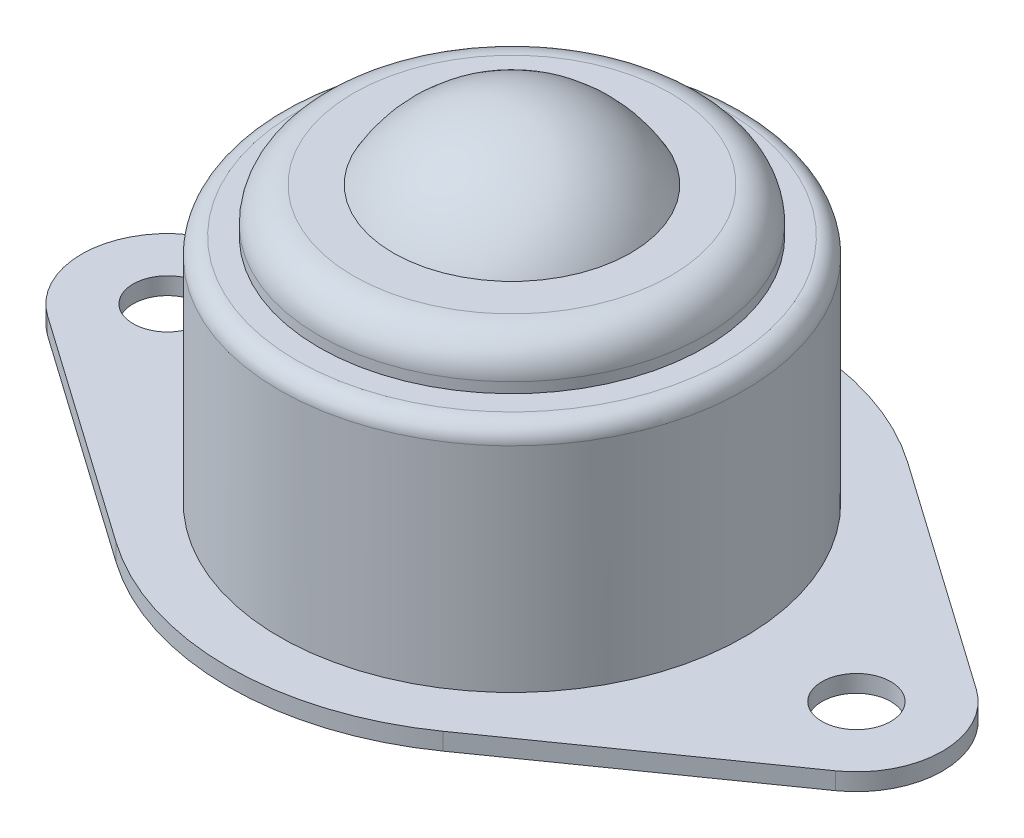
ISO-10303-21;
HEADER;
FILE_DESCRIPTION(('STEP AP214'),'2;1');
FILE_NAME('part.step','',(''),(''),'','','');
FILE_SCHEMA(('AUTOMOTIVE_DESIGN { 1 0 10303 214 1 1 1 1 }'));
ENDSEC;
DATA;
#1=APPLICATION_CONTEXT('core data for automotive mechanical design processes');
#2=APPLICATION_PROTOCOL_DEFINITION('international standard','automotive_design',2000,#1);
#3=PRODUCT_CONTEXT('',#1,'mechanical');
#4=PRODUCT('Part','Part','',(#3));
#5=PRODUCT_RELATED_PRODUCT_CATEGORY('part','',(#4));
#6=PRODUCT_DEFINITION_FORMATION('','',#4);
#7=PRODUCT_DEFINITION_CONTEXT('part definition',#1,'design');
#8=PRODUCT_DEFINITION('design','',#6,#7);
#9=PRODUCT_DEFINITION_SHAPE('','',#8);
#10=(LENGTH_UNIT() NAMED_UNIT(*) SI_UNIT(.MILLI.,.METRE.));
#11=(NAMED_UNIT(*) PLANE_ANGLE_UNIT() SI_UNIT($,.RADIAN.));
#12=(NAMED_UNIT(*) SI_UNIT($,.STERADIAN.) SOLID_ANGLE_UNIT());
#13=UNCERTAINTY_MEASURE_WITH_UNIT(LENGTH_MEASURE(1.E-05),#10,'distance_accuracy_value','');
#14=(GEOMETRIC_REPRESENTATION_CONTEXT(3) GLOBAL_UNCERTAINTY_ASSIGNED_CONTEXT((#13)) GLOBAL_UNIT_ASSIGNED_CONTEXT((#10,
#11,#12)) REPRESENTATION_CONTEXT('',''));
#15=CARTESIAN_POINT('',(0.,0.,0.));
#16=DIRECTION('',(0.,0.,1.));
#17=DIRECTION('',(1.,0.,0.));
#18=AXIS2_PLACEMENT_3D('',#15,#16,#17);
#19=CARTESIAN_POINT('',(0.,12.0625,0.));
#20=DIRECTION('',(0.,-1.,0.));
#21=DIRECTION('',(-1.,0.,0.));
#22=AXIS2_PLACEMENT_3D('',#19,#20,#21);
#23=SPHERICAL_SURFACE('',#22,7.9375);
#24=CARTESIAN_POINT('',(0.,4.125,0.));
#25=VERTEX_POINT('',#24);
#26=VERTEX_LOOP('',#25);
#27=FACE_BOUND('',#26,.T.);
#28=ADVANCED_FACE('F53',(#27),#23,.T.);
#29=CLOSED_SHELL('',(#28));
#30=MANIFOLD_SOLID_BREP('B2',#29);
#31=CARTESIAN_POINT('',(0.,12.0625,0.));
#32=DIRECTION('',(0.,-1.,0.));
#33=DIRECTION('',(-1.,0.,0.));
#34=AXIS2_PLACEMENT_3D('',#31,#32,#33);
#35=SPHERICAL_SURFACE('',#34,7.9375);
#36=CARTESIAN_POINT('',(0.,16.,0.));
#37=DIRECTION('',(0.,-1.,0.));
#38=DIRECTION('',(0.,0.,-1.));
#39=AXIS2_PLACEMENT_3D('',#36,#37,#38);
#40=CIRCLE('',#39,6.89202437604511);
#41=CARTESIAN_POINT('',(0.,16.,-6.89202437604511));
#42=VERTEX_POINT('',#41);
#43=EDGE_CURVE('E224',#42,#42,#40,.T.);
#44=ORIENTED_EDGE('',*,*,#43,.F.);
#45=EDGE_LOOP('',(#44));
#46=FACE_BOUND('',#45,.T.);
#47=ADVANCED_FACE('F67',(#46),#35,.F.);
#48=CARTESIAN_POINT('',(0.,16.,0.));
#49=DIRECTION('',(0.,1.,0.));
#50=DIRECTION('',(0.,0.,1.));
#51=AXIS2_PLACEMENT_3D('',#48,#49,#50);
#52=PLANE('',#51);
#53=CARTESIAN_POINT('',(0.,16.,0.));
#54=DIRECTION('',(0.,1.,0.));
#55=DIRECTION('',(0.,0.,1.));
#56=AXIS2_PLACEMENT_3D('',#53,#54,#55);
#57=CIRCLE('',#56,9.2);
#58=CARTESIAN_POINT('',(0.,16.,9.2));
#59=VERTEX_POINT('',#58);
#60=EDGE_CURVE('E51',#59,#59,#57,.T.);
#61=ORIENTED_EDGE('',*,*,#60,.T.);
#62=EDGE_LOOP('',(#61));
#63=FACE_BOUND('',#62,.T.);
#64=ORIENTED_EDGE('',*,*,#43,.T.);
#65=EDGE_LOOP('',(#64));
#66=FACE_BOUND('',#65,.T.);
#67=ADVANCED_FACE('F251',(#63,#66),#52,.T.);
#68=CARTESIAN_POINT('',(0.,0.,0.));
#69=DIRECTION('',(0.,-1.,0.));
#70=DIRECTION('',(0.,0.,-1.));
#71=AXIS2_PLACEMENT_3D('',#68,#69,#70);
#72=CYLINDRICAL_SURFACE('',#71,11.2);
#73=CARTESIAN_POINT('',(0.,14.,0.));
#74=DIRECTION('',(0.,1.,0.));
#75=DIRECTION('',(0.,0.,1.));
#76=AXIS2_PLACEMENT_3D('',#73,#74,#75);
#77=CIRCLE('',#76,11.2);
#78=CARTESIAN_POINT('',(0.,14.,11.2));
#79=VERTEX_POINT('',#78);
#80=EDGE_CURVE('E77',#79,#79,#77,.F.);
#81=ORIENTED_EDGE('',*,*,#80,.T.);
#82=EDGE_LOOP('',(#81));
#83=FACE_BOUND('',#82,.T.);
#84=CARTESIAN_POINT('',(0.,13.4,0.));
#85=DIRECTION('',(0.,-1.,0.));
#86=DIRECTION('',(0.,0.,-1.));
#87=AXIS2_PLACEMENT_3D('',#84,#85,#86);
#88=CIRCLE('',#87,11.2);
#89=CARTESIAN_POINT('',(0.,13.4,-11.2));
#90=VERTEX_POINT('',#89);
#91=EDGE_CURVE('E220',#90,#90,#88,.T.);
#92=ORIENTED_EDGE('',*,*,#91,.F.);
#93=EDGE_LOOP('',(#92));
#94=FACE_BOUND('',#93,.T.);
#95=ADVANCED_FACE('F239',(#83,#94),#72,.T.);
#96=CARTESIAN_POINT('',(0.,13.4,0.));
#97=DIRECTION('',(0.,1.,0.));
#98=DIRECTION('',(0.,0.,1.));
#99=AXIS2_PLACEMENT_3D('',#96,#97,#98);
#100=PLANE('',#99);
#101=CARTESIAN_POINT('',(0.,13.4,0.));
#102=DIRECTION('',(0.,1.,0.));
#103=DIRECTION('',(0.,0.,1.));
#104=AXIS2_PLACEMENT_3D('',#101,#102,#103);
#105=CIRCLE('',#104,12.5);
#106=CARTESIAN_POINT('',(0.,13.4,12.5));
#107=VERTEX_POINT('',#106);
#108=EDGE_CURVE('E232',#107,#107,#105,.T.);
#109=ORIENTED_EDGE('',*,*,#108,.T.);
#110=EDGE_LOOP('',(#109));
#111=FACE_BOUND('',#110,.T.);
#112=ORIENTED_EDGE('',*,*,#91,.T.);
#113=EDGE_LOOP('',(#112));
#114=FACE_BOUND('',#113,.T.);
#115=ADVANCED_FACE('F262',(#111,#114),#100,.T.);
#116=CARTESIAN_POINT('',(0.,0.,0.));
#117=DIRECTION('',(0.,-1.,0.));
#118=DIRECTION('',(0.,0.,-1.));
#119=AXIS2_PLACEMENT_3D('',#116,#117,#118);
#120=CYLINDRICAL_SURFACE('',#119,13.5);
#121=CARTESIAN_POINT('',(0.,12.4,0.));
#122=DIRECTION('',(0.,1.,0.));
#123=DIRECTION('',(0.,0.,1.));
#124=AXIS2_PLACEMENT_3D('',#121,#122,#123);
#125=CIRCLE('',#124,13.5);
#126=CARTESIAN_POINT('',(0.,12.4,13.5));
#127=VERTEX_POINT('',#126);
#128=EDGE_CURVE('E228',#127,#127,#125,.F.);
#129=ORIENTED_EDGE('',*,*,#128,.T.);
#130=EDGE_LOOP('',(#129));
#131=FACE_BOUND('',#130,.T.);
#132=CARTESIAN_POINT('',(0.,0.,0.));
#133=DIRECTION('',(0.,-1.,0.));
#134=DIRECTION('',(0.,0.,-1.));
#135=AXIS2_PLACEMENT_3D('',#132,#133,#134);
#136=CIRCLE('',#135,13.5);
#137=CARTESIAN_POINT('',(0.,0.,-13.5));
#138=VERTEX_POINT('',#137);
#139=EDGE_CURVE('E216',#138,#138,#136,.T.);
#140=ORIENTED_EDGE('',*,*,#139,.F.);
#141=EDGE_LOOP('',(#140));
#142=FACE_BOUND('',#141,.T.);
#143=ADVANCED_FACE('F265',(#131,#142),#120,.T.);
#144=CARTESIAN_POINT('',(-20.,-1.,0.));
#145=DIRECTION('',(0.,-1.,0.));
#146=DIRECTION('',(0.,0.,-1.));
#147=AXIS2_PLACEMENT_3D('',#144,#145,#146);
#148=PLANE('',#147);
#149=CARTESIAN_POINT('',(-20.,-1.,0.));
#150=DIRECTION('',(0.,-1.,0.));
#151=DIRECTION('',(0.,0.,-1.));
#152=AXIS2_PLACEMENT_3D('',#149,#150,#151);
#153=CIRCLE('',#152,2.);
#154=CARTESIAN_POINT('',(-20.,-1.,-2.));
#155=VERTEX_POINT('',#154);
#156=EDGE_CURVE('E177',#155,#155,#153,.T.);
#157=ORIENTED_EDGE('',*,*,#156,.F.);
#158=EDGE_LOOP('',(#157));
#159=FACE_BOUND('',#158,.T.);
#160=CARTESIAN_POINT('',(-20.,-1.,0.));
#161=DIRECTION('',(0.,-1.,0.));
#162=DIRECTION('',(0.,0.,-1.));
#163=AXIS2_PLACEMENT_3D('',#160,#161,#162);
#164=CIRCLE('',#163,5.);
#165=CARTESIAN_POINT('',(-22.875,-1.,4.0907670429884));
#166=VERTEX_POINT('',#165);
#167=CARTESIAN_POINT('',(-22.875,-1.,-4.09076704298839));
#168=VERTEX_POINT('',#167);
#169=EDGE_CURVE('E194',#166,#168,#164,.T.);
#170=ORIENTED_EDGE('',*,*,#169,.T.);
#171=DIRECTION('',(0.818153408597678,0.,-0.575));
#172=VECTOR('',#171,1.);
#173=CARTESIAN_POINT('',(-9.4875,-1.,-13.4995312418617));
#174=LINE('',#173,#172);
#175=CARTESIAN_POINT('',(-9.4875,-1.,-13.4995312418617));
#176=VERTEX_POINT('',#175);
#177=EDGE_CURVE('E129',#168,#176,#174,.T.);
#178=ORIENTED_EDGE('',*,*,#177,.T.);
#179=CARTESIAN_POINT('',(0.,-1.,0.));
#180=DIRECTION('',(0.,-1.,0.));
#181=DIRECTION('',(0.,0.,-1.));
#182=AXIS2_PLACEMENT_3D('',#179,#180,#181);
#183=CIRCLE('',#182,16.5);
#184=CARTESIAN_POINT('',(9.4875,-1.,-13.4995312418617));
#185=VERTEX_POINT('',#184);
#186=EDGE_CURVE('E334',#176,#185,#183,.T.);
#187=ORIENTED_EDGE('',*,*,#186,.T.);
#188=DIRECTION('',(0.818153408597678,0.,0.575));
#189=VECTOR('',#188,1.);
#190=CARTESIAN_POINT('',(22.875,-1.,-4.0907670429884));
#191=LINE('',#190,#189);
#192=CARTESIAN_POINT('',(22.875,-1.,-4.0907670429884));
#193=VERTEX_POINT('',#192);
#194=EDGE_CURVE('E337',#185,#193,#191,.T.);
#195=ORIENTED_EDGE('',*,*,#194,.T.);
#196=CARTESIAN_POINT('',(20.,-1.,0.));
#197=DIRECTION('',(0.,-1.,0.));
#198=DIRECTION('',(0.,0.,-1.));
#199=AXIS2_PLACEMENT_3D('',#196,#197,#198);
#200=CIRCLE('',#199,5.);
#201=CARTESIAN_POINT('',(22.875,-1.,4.09076704298839));
#202=VERTEX_POINT('',#201);
#203=EDGE_CURVE('E149',#193,#202,#200,.T.);
#204=ORIENTED_EDGE('',*,*,#203,.T.);
#205=DIRECTION('',(-0.818153408597679,0.,0.575));
#206=VECTOR('',#205,1.);
#207=CARTESIAN_POINT('',(9.4875,-1.,13.4995312418617));
#208=LINE('',#207,#206);
#209=CARTESIAN_POINT('',(9.4875,-1.,13.4995312418617));
#210=VERTEX_POINT('',#209);
#211=EDGE_CURVE('E142',#202,#210,#208,.T.);
#212=ORIENTED_EDGE('',*,*,#211,.T.);
#213=CARTESIAN_POINT('',(0.,-1.,0.));
#214=DIRECTION('',(0.,-1.,0.));
#215=DIRECTION('',(0.,0.,-1.));
#216=AXIS2_PLACEMENT_3D('',#213,#214,#215);
#217=CIRCLE('',#216,16.5);
#218=CARTESIAN_POINT('',(-9.4875,-1.,13.4995312418617));
#219=VERTEX_POINT('',#218);
#220=EDGE_CURVE('E147',#210,#219,#217,.T.);
#221=ORIENTED_EDGE('',*,*,#220,.T.);
#222=DIRECTION('',(-0.818153408597678,0.,-0.575));
#223=VECTOR('',#222,1.);
#224=CARTESIAN_POINT('',(-22.875,-1.,4.0907670429884));
#225=LINE('',#224,#223);
#226=EDGE_CURVE('E85',#219,#166,#225,.T.);
#227=ORIENTED_EDGE('',*,*,#226,.T.);
#228=EDGE_LOOP('',(#170,#178,#187,#195,#204,#212,#221,#227));
#229=FACE_BOUND('',#228,.T.);
#230=CARTESIAN_POINT('',(20.,-1.,0.));
#231=DIRECTION('',(0.,-1.,0.));
#232=DIRECTION('',(0.,0.,-1.));
#233=AXIS2_PLACEMENT_3D('',#230,#231,#232);
#234=CIRCLE('',#233,2.);
#235=CARTESIAN_POINT('',(20.,-1.,-2.));
#236=VERTEX_POINT('',#235);
#237=EDGE_CURVE('E313',#236,#236,#234,.T.);
#238=ORIENTED_EDGE('',*,*,#237,.F.);
#239=EDGE_LOOP('',(#238));
#240=FACE_BOUND('',#239,.T.);
#241=ADVANCED_FACE('F144',(#159,#229,#240),#148,.T.);
#242=CARTESIAN_POINT('',(-20.,0.,0.));
#243=DIRECTION('',(0.,-1.,0.));
#244=DIRECTION('',(0.,0.,-1.));
#245=AXIS2_PLACEMENT_3D('',#242,#243,#244);
#246=PLANE('',#245);
#247=ORIENTED_EDGE('',*,*,#139,.T.);
#248=EDGE_LOOP('',(#247));
#249=FACE_BOUND('',#248,.T.);
#250=CARTESIAN_POINT('',(-20.,0.,0.));
#251=DIRECTION('',(0.,-1.,0.));
#252=DIRECTION('',(0.,0.,-1.));
#253=AXIS2_PLACEMENT_3D('',#250,#251,#252);
#254=CIRCLE('',#253,5.);
#255=CARTESIAN_POINT('',(-22.875,0.,4.0907670429884));
#256=VERTEX_POINT('',#255);
#257=CARTESIAN_POINT('',(-22.875,0.,-4.09076704298839));
#258=VERTEX_POINT('',#257);
#259=EDGE_CURVE('E172',#256,#258,#254,.T.);
#260=ORIENTED_EDGE('',*,*,#259,.F.);
#261=DIRECTION('',(-0.818153408597678,0.,-0.575));
#262=VECTOR('',#261,1.);
#263=CARTESIAN_POINT('',(-22.875,0.,4.0907670429884));
#264=LINE('',#263,#262);
#265=CARTESIAN_POINT('',(-9.4875,0.,13.4995312418617));
#266=VERTEX_POINT('',#265);
#267=EDGE_CURVE('E120',#266,#256,#264,.T.);
#268=ORIENTED_EDGE('',*,*,#267,.F.);
#269=CARTESIAN_POINT('',(0.,0.,0.));
#270=DIRECTION('',(0.,-1.,0.));
#271=DIRECTION('',(0.,0.,-1.));
#272=AXIS2_PLACEMENT_3D('',#269,#270,#271);
#273=CIRCLE('',#272,16.5);
#274=CARTESIAN_POINT('',(9.4875,0.,13.4995312418617));
#275=VERTEX_POINT('',#274);
#276=EDGE_CURVE('E114',#275,#266,#273,.T.);
#277=ORIENTED_EDGE('',*,*,#276,.F.);
#278=DIRECTION('',(-0.818153408597679,0.,0.575));
#279=VECTOR('',#278,1.);
#280=CARTESIAN_POINT('',(9.4875,0.,13.4995312418617));
#281=LINE('',#280,#279);
#282=CARTESIAN_POINT('',(22.875,0.,4.09076704298839));
#283=VERTEX_POINT('',#282);
#284=EDGE_CURVE('E158',#283,#275,#281,.T.);
#285=ORIENTED_EDGE('',*,*,#284,.F.);
#286=CARTESIAN_POINT('',(20.,0.,0.));
#287=DIRECTION('',(0.,-1.,0.));
#288=DIRECTION('',(0.,0.,-1.));
#289=AXIS2_PLACEMENT_3D('',#286,#287,#288);
#290=CIRCLE('',#289,5.);
#291=CARTESIAN_POINT('',(22.875,0.,-4.0907670429884));
#292=VERTEX_POINT('',#291);
#293=EDGE_CURVE('E186',#292,#283,#290,.T.);
#294=ORIENTED_EDGE('',*,*,#293,.F.);
#295=DIRECTION('',(0.818153408597678,0.,0.575));
#296=VECTOR('',#295,1.);
#297=CARTESIAN_POINT('',(22.875,0.,-4.0907670429884));
#298=LINE('',#297,#296);
#299=CARTESIAN_POINT('',(9.4875,0.,-13.4995312418617));
#300=VERTEX_POINT('',#299);
#301=EDGE_CURVE('E183',#300,#292,#298,.T.);
#302=ORIENTED_EDGE('',*,*,#301,.F.);
#303=CARTESIAN_POINT('',(0.,0.,0.));
#304=DIRECTION('',(0.,-1.,0.));
#305=DIRECTION('',(0.,0.,-1.));
#306=AXIS2_PLACEMENT_3D('',#303,#304,#305);
#307=CIRCLE('',#306,16.5);
#308=CARTESIAN_POINT('',(-9.4875,0.,-13.4995312418617));
#309=VERTEX_POINT('',#308);
#310=EDGE_CURVE('E180',#309,#300,#307,.T.);
#311=ORIENTED_EDGE('',*,*,#310,.F.);
#312=DIRECTION('',(0.818153408597678,0.,-0.575));
#313=VECTOR('',#312,1.);
#314=CARTESIAN_POINT('',(-9.4875,0.,-13.4995312418617));
#315=LINE('',#314,#313);
#316=EDGE_CURVE('E176',#258,#309,#315,.T.);
#317=ORIENTED_EDGE('',*,*,#316,.F.);
#318=EDGE_LOOP('',(#260,#268,#277,#285,#294,#302,#311,#317));
#319=FACE_BOUND('',#318,.T.);
#320=CARTESIAN_POINT('',(-20.,0.,0.));
#321=DIRECTION('',(0.,-1.,0.));
#322=DIRECTION('',(0.,0.,-1.));
#323=AXIS2_PLACEMENT_3D('',#320,#321,#322);
#324=CIRCLE('',#323,2.);
#325=CARTESIAN_POINT('',(-20.,0.,-2.));
#326=VERTEX_POINT('',#325);
#327=EDGE_CURVE('E321',#326,#326,#324,.T.);
#328=ORIENTED_EDGE('',*,*,#327,.T.);
#329=EDGE_LOOP('',(#328));
#330=FACE_BOUND('',#329,.T.);
#331=CARTESIAN_POINT('',(20.,0.,0.));
#332=DIRECTION('',(0.,-1.,0.));
#333=DIRECTION('',(0.,0.,-1.));
#334=AXIS2_PLACEMENT_3D('',#331,#332,#333);
#335=CIRCLE('',#334,2.);
#336=CARTESIAN_POINT('',(20.,0.,-2.));
#337=VERTEX_POINT('',#336);
#338=EDGE_CURVE('E316',#337,#337,#335,.T.);
#339=ORIENTED_EDGE('',*,*,#338,.T.);
#340=EDGE_LOOP('',(#339));
#341=FACE_BOUND('',#340,.T.);
#342=ADVANCED_FACE('F274',(#249,#319,#330,#341),#246,.F.);
#343=CARTESIAN_POINT('',(-20.,-1.,0.));
#344=DIRECTION('',(0.,1.,0.));
#345=DIRECTION('',(0.,0.,1.));
#346=AXIS2_PLACEMENT_3D('',#343,#344,#345);
#347=CYLINDRICAL_SURFACE('',#346,5.);
#348=ORIENTED_EDGE('',*,*,#259,.T.);
#349=DIRECTION('',(0.,1.,0.));
#350=VECTOR('',#349,1.);
#351=CARTESIAN_POINT('',(-22.875,-1.,-4.09076704298839));
#352=LINE('',#351,#350);
#353=EDGE_CURVE('E213',#168,#258,#352,.T.);
#354=ORIENTED_EDGE('',*,*,#353,.F.);
#355=ORIENTED_EDGE('',*,*,#169,.F.);
#356=DIRECTION('',(0.,1.,0.));
#357=VECTOR('',#356,1.);
#358=CARTESIAN_POINT('',(-22.875,-1.,4.0907670429884));
#359=LINE('',#358,#357);
#360=EDGE_CURVE('E168',#166,#256,#359,.T.);
#361=ORIENTED_EDGE('',*,*,#360,.T.);
#362=EDGE_LOOP('',(#348,#354,#355,#361));
#363=FACE_BOUND('',#362,.T.);
#364=ADVANCED_FACE('F270',(#363),#347,.T.);
#365=CARTESIAN_POINT('',(-9.4875,-1.,-13.4995312418617));
#366=DIRECTION('',(0.575,0.,0.818153408597679));
#367=DIRECTION('',(0.818153408597679,0.,-0.575));
#368=AXIS2_PLACEMENT_3D('',#365,#366,#367);
#369=PLANE('',#368);
#370=ORIENTED_EDGE('',*,*,#316,.T.);
#371=DIRECTION('',(0.,1.,0.));
#372=VECTOR('',#371,1.);
#373=CARTESIAN_POINT('',(-9.4875,-1.,-13.4995312418617));
#374=LINE('',#373,#372);
#375=EDGE_CURVE('E209',#176,#309,#374,.T.);
#376=ORIENTED_EDGE('',*,*,#375,.F.);
#377=ORIENTED_EDGE('',*,*,#177,.F.);
#378=ORIENTED_EDGE('',*,*,#353,.T.);
#379=EDGE_LOOP('',(#370,#376,#377,#378));
#380=FACE_BOUND('',#379,.T.);
#381=ADVANCED_FACE('F273',(#380),#369,.F.);
#382=CARTESIAN_POINT('',(0.,-1.,0.));
#383=DIRECTION('',(0.,1.,0.));
#384=DIRECTION('',(0.,0.,1.));
#385=AXIS2_PLACEMENT_3D('',#382,#383,#384);
#386=CYLINDRICAL_SURFACE('',#385,16.5);
#387=ORIENTED_EDGE('',*,*,#310,.T.);
#388=DIRECTION('',(0.,1.,0.));
#389=VECTOR('',#388,1.);
#390=CARTESIAN_POINT('',(9.4875,-1.,-13.4995312418617));
#391=LINE('',#390,#389);
#392=EDGE_CURVE('E205',#185,#300,#391,.T.);
#393=ORIENTED_EDGE('',*,*,#392,.F.);
#394=ORIENTED_EDGE('',*,*,#186,.F.);
#395=ORIENTED_EDGE('',*,*,#375,.T.);
#396=EDGE_LOOP('',(#387,#393,#394,#395));
#397=FACE_BOUND('',#396,.T.);
#398=ADVANCED_FACE('F278',(#397),#386,.T.);
#399=CARTESIAN_POINT('',(22.875,-1.,-4.0907670429884));
#400=DIRECTION('',(-0.575,0.,0.818153408597678));
#401=DIRECTION('',(0.818153408597679,0.,0.575));
#402=AXIS2_PLACEMENT_3D('',#399,#400,#401);
#403=PLANE('',#402);
#404=ORIENTED_EDGE('',*,*,#301,.T.);
#405=DIRECTION('',(0.,1.,0.));
#406=VECTOR('',#405,1.);
#407=CARTESIAN_POINT('',(22.875,-1.,-4.0907670429884));
#408=LINE('',#407,#406);
#409=EDGE_CURVE('E201',#193,#292,#408,.T.);
#410=ORIENTED_EDGE('',*,*,#409,.F.);
#411=ORIENTED_EDGE('',*,*,#194,.F.);
#412=ORIENTED_EDGE('',*,*,#392,.T.);
#413=EDGE_LOOP('',(#404,#410,#411,#412));
#414=FACE_BOUND('',#413,.T.);
#415=ADVANCED_FACE('F281',(#414),#403,.F.);
#416=CARTESIAN_POINT('',(20.,-1.,0.));
#417=DIRECTION('',(0.,1.,0.));
#418=DIRECTION('',(0.,0.,1.));
#419=AXIS2_PLACEMENT_3D('',#416,#417,#418);
#420=CYLINDRICAL_SURFACE('',#419,5.);
#421=ORIENTED_EDGE('',*,*,#293,.T.);
#422=DIRECTION('',(0.,1.,0.));
#423=VECTOR('',#422,1.);
#424=CARTESIAN_POINT('',(22.875,-1.,4.09076704298839));
#425=LINE('',#424,#423);
#426=EDGE_CURVE('E160',#202,#283,#425,.T.);
#427=ORIENTED_EDGE('',*,*,#426,.F.);
#428=ORIENTED_EDGE('',*,*,#203,.F.);
#429=ORIENTED_EDGE('',*,*,#409,.T.);
#430=EDGE_LOOP('',(#421,#427,#428,#429));
#431=FACE_BOUND('',#430,.T.);
#432=ADVANCED_FACE('F285',(#431),#420,.T.);
#433=CARTESIAN_POINT('',(9.4875,-1.,13.4995312418617));
#434=DIRECTION('',(-0.575,0.,-0.818153408597679));
#435=DIRECTION('',(-0.818153408597679,0.,0.575));
#436=AXIS2_PLACEMENT_3D('',#433,#434,#435);
#437=PLANE('',#436);
#438=ORIENTED_EDGE('',*,*,#284,.T.);
#439=DIRECTION('',(0.,1.,0.));
#440=VECTOR('',#439,1.);
#441=CARTESIAN_POINT('',(9.4875,-1.,13.4995312418617));
#442=LINE('',#441,#440);
#443=EDGE_CURVE('E155',#210,#275,#442,.T.);
#444=ORIENTED_EDGE('',*,*,#443,.F.);
#445=ORIENTED_EDGE('',*,*,#211,.F.);
#446=ORIENTED_EDGE('',*,*,#426,.T.);
#447=EDGE_LOOP('',(#438,#444,#445,#446));
#448=FACE_BOUND('',#447,.T.);
#449=ADVANCED_FACE('F156',(#448),#437,.F.);
#450=CARTESIAN_POINT('',(0.,-1.,0.));
#451=DIRECTION('',(0.,1.,0.));
#452=DIRECTION('',(0.,0.,1.));
#453=AXIS2_PLACEMENT_3D('',#450,#451,#452);
#454=CYLINDRICAL_SURFACE('',#453,16.5);
#455=ORIENTED_EDGE('',*,*,#276,.T.);
#456=DIRECTION('',(0.,1.,0.));
#457=VECTOR('',#456,1.);
#458=CARTESIAN_POINT('',(-9.4875,-1.,13.4995312418617));
#459=LINE('',#458,#457);
#460=EDGE_CURVE('E161',#219,#266,#459,.T.);
#461=ORIENTED_EDGE('',*,*,#460,.F.);
#462=ORIENTED_EDGE('',*,*,#220,.F.);
#463=ORIENTED_EDGE('',*,*,#443,.T.);
#464=EDGE_LOOP('',(#455,#461,#462,#463));
#465=FACE_BOUND('',#464,.T.);
#466=ADVANCED_FACE('F163',(#465),#454,.T.);
#467=CARTESIAN_POINT('',(-22.875,-1.,4.0907670429884));
#468=DIRECTION('',(0.575,0.,-0.818153408597678));
#469=DIRECTION('',(-0.818153408597679,0.,-0.575));
#470=AXIS2_PLACEMENT_3D('',#467,#468,#469);
#471=PLANE('',#470);
#472=ORIENTED_EDGE('',*,*,#267,.T.);
#473=ORIENTED_EDGE('',*,*,#360,.F.);
#474=ORIENTED_EDGE('',*,*,#226,.F.);
#475=ORIENTED_EDGE('',*,*,#460,.T.);
#476=EDGE_LOOP('',(#472,#473,#474,#475));
#477=FACE_BOUND('',#476,.T.);
#478=ADVANCED_FACE('F294',(#477),#471,.F.);
#479=CARTESIAN_POINT('',(-20.,-1.,0.));
#480=DIRECTION('',(0.,1.,0.));
#481=DIRECTION('',(0.,0.,1.));
#482=AXIS2_PLACEMENT_3D('',#479,#480,#481);
#483=CYLINDRICAL_SURFACE('',#482,2.);
#484=ORIENTED_EDGE('',*,*,#156,.T.);
#485=EDGE_LOOP('',(#484));
#486=FACE_BOUND('',#485,.T.);
#487=ORIENTED_EDGE('',*,*,#327,.F.);
#488=EDGE_LOOP('',(#487));
#489=FACE_BOUND('',#488,.T.);
#490=ADVANCED_FACE('F297',(#486,#489),#483,.F.);
#491=CARTESIAN_POINT('',(20.,-1.,0.));
#492=DIRECTION('',(0.,1.,0.));
#493=DIRECTION('',(0.,0.,1.));
#494=AXIS2_PLACEMENT_3D('',#491,#492,#493);
#495=CYLINDRICAL_SURFACE('',#494,2.);
#496=ORIENTED_EDGE('',*,*,#237,.T.);
#497=EDGE_LOOP('',(#496));
#498=FACE_BOUND('',#497,.T.);
#499=ORIENTED_EDGE('',*,*,#338,.F.);
#500=EDGE_LOOP('',(#499));
#501=FACE_BOUND('',#500,.T.);
#502=ADVANCED_FACE('F247',(#498,#501),#495,.F.);
#503=CARTESIAN_POINT('',(0.,12.4,0.));
#504=DIRECTION('',(0.,1.,0.));
#505=DIRECTION('',(0.,0.,1.));
#506=AXIS2_PLACEMENT_3D('',#503,#504,#505);
#507=TOROIDAL_SURFACE('',#506,12.5,1.);
#508=ORIENTED_EDGE('',*,*,#108,.F.);
#509=EDGE_LOOP('',(#508));
#510=FACE_BOUND('',#509,.T.);
#511=ORIENTED_EDGE('',*,*,#128,.F.);
#512=EDGE_LOOP('',(#511));
#513=FACE_BOUND('',#512,.T.);
#514=ADVANCED_FACE('F243',(#510,#513),#507,.T.);
#515=CARTESIAN_POINT('',(0.,14.,0.));
#516=DIRECTION('',(0.,1.,0.));
#517=DIRECTION('',(0.,0.,1.));
#518=AXIS2_PLACEMENT_3D('',#515,#516,#517);
#519=TOROIDAL_SURFACE('',#518,9.2,2.);
#520=ORIENTED_EDGE('',*,*,#60,.F.);
#521=EDGE_LOOP('',(#520));
#522=FACE_BOUND('',#521,.T.);
#523=ORIENTED_EDGE('',*,*,#80,.F.);
#524=EDGE_LOOP('',(#523));
#525=FACE_BOUND('',#524,.T.);
#526=ADVANCED_FACE('F69',(#522,#525),#519,.T.);
#527=CLOSED_SHELL('',(#47,#67,#95,#115,#143,#241,#342,#364,#381,#398,#415,#432,#449,#466,#478,
#490,#502,#514,#526));
#528=MANIFOLD_SOLID_BREP('B6',#527);
#529=ADVANCED_BREP_SHAPE_REPRESENTATION('',(#18,#30,#528),#14);
#530=SHAPE_DEFINITION_REPRESENTATION(#9,#529);
ENDSEC;
END-ISO-10303-21;
